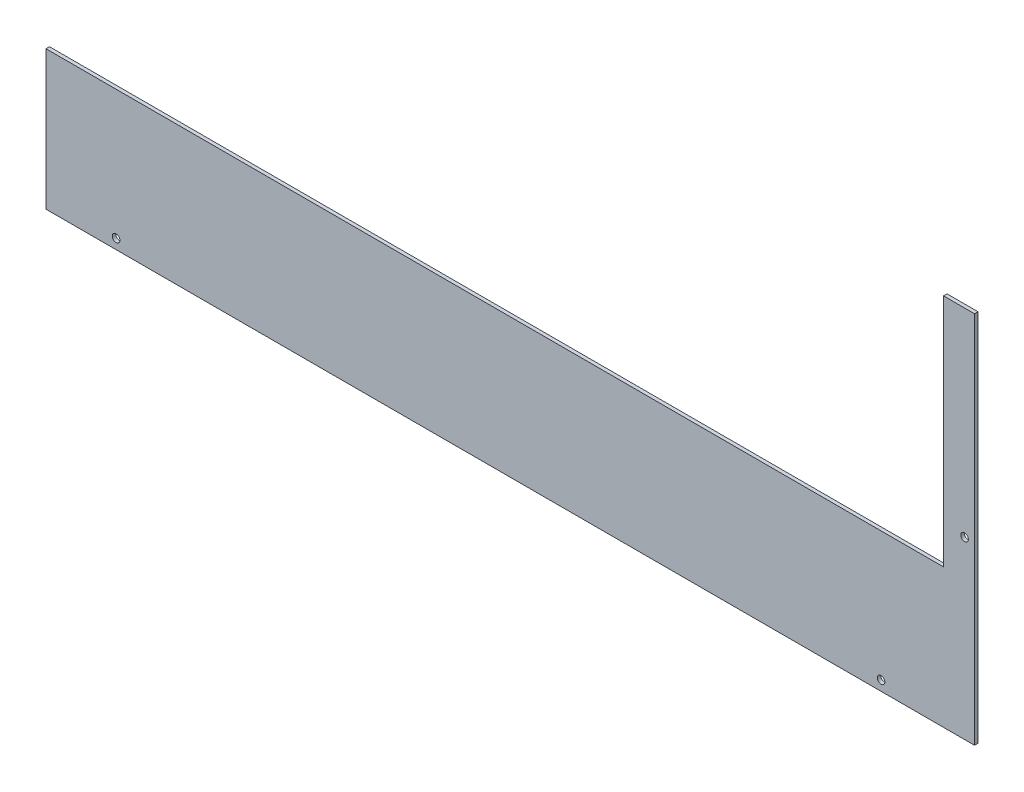
ISO-10303-21;
HEADER;
FILE_DESCRIPTION(('STEP AP214'),'2;1');
FILE_NAME('part.step','',(''),(''),'','','');
FILE_SCHEMA(('AUTOMOTIVE_DESIGN { 1 0 10303 214 1 1 1 1 }'));
ENDSEC;
DATA;
#1=APPLICATION_CONTEXT('core data for automotive mechanical design processes');
#2=APPLICATION_PROTOCOL_DEFINITION('international standard','automotive_design',2000,#1);
#3=PRODUCT_CONTEXT('',#1,'mechanical');
#4=PRODUCT('Part','Part','',(#3));
#5=PRODUCT_RELATED_PRODUCT_CATEGORY('part','',(#4));
#6=PRODUCT_DEFINITION_FORMATION('','',#4);
#7=PRODUCT_DEFINITION_CONTEXT('part definition',#1,'design');
#8=PRODUCT_DEFINITION('design','',#6,#7);
#9=PRODUCT_DEFINITION_SHAPE('','',#8);
#10=(LENGTH_UNIT() NAMED_UNIT(*) SI_UNIT(.MILLI.,.METRE.));
#11=(NAMED_UNIT(*) PLANE_ANGLE_UNIT() SI_UNIT($,.RADIAN.));
#12=(NAMED_UNIT(*) SI_UNIT($,.STERADIAN.) SOLID_ANGLE_UNIT());
#13=UNCERTAINTY_MEASURE_WITH_UNIT(LENGTH_MEASURE(1.E-05),#10,'distance_accuracy_value','');
#14=(GEOMETRIC_REPRESENTATION_CONTEXT(3) GLOBAL_UNCERTAINTY_ASSIGNED_CONTEXT((#13)) GLOBAL_UNIT_ASSIGNED_CONTEXT((#10,
#11,#12)) REPRESENTATION_CONTEXT('',''));
#15=CARTESIAN_POINT('',(0.,0.,0.));
#16=DIRECTION('',(0.,0.,1.));
#17=DIRECTION('',(1.,0.,0.));
#18=AXIS2_PLACEMENT_3D('',#15,#16,#17);
#19=CARTESIAN_POINT('',(0.,0.,3.));
#20=DIRECTION('',(0.,0.,-1.));
#21=DIRECTION('',(-1.,0.,0.));
#22=AXIS2_PLACEMENT_3D('',#19,#20,#21);
#23=PLANE('',#22);
#24=DIRECTION('',(0.,-1.,0.));
#25=VECTOR('',#24,1.);
#26=CARTESIAN_POINT('',(0.,0.,3.));
#27=LINE('',#26,#25);
#28=CARTESIAN_POINT('',(0.,119.,3.));
#29=VERTEX_POINT('',#28);
#30=CARTESIAN_POINT('',(0.,0.,3.));
#31=VERTEX_POINT('',#30);
#32=EDGE_CURVE('E152',#29,#31,#27,.T.);
#33=ORIENTED_EDGE('',*,*,#32,.T.);
#34=DIRECTION('',(1.,0.,0.));
#35=VECTOR('',#34,1.);
#36=CARTESIAN_POINT('',(0.,0.,3.));
#37=LINE('',#36,#35);
#38=CARTESIAN_POINT('',(795.,0.,3.));
#39=VERTEX_POINT('',#38);
#40=EDGE_CURVE('E100',#31,#39,#37,.T.);
#41=ORIENTED_EDGE('',*,*,#40,.T.);
#42=DIRECTION('',(0.,1.,0.));
#43=VECTOR('',#42,1.);
#44=CARTESIAN_POINT('',(795.,0.,3.));
#45=LINE('',#44,#43);
#46=CARTESIAN_POINT('',(795.,320.,3.));
#47=VERTEX_POINT('',#46);
#48=EDGE_CURVE('E113',#39,#47,#45,.T.);
#49=ORIENTED_EDGE('',*,*,#48,.T.);
#50=DIRECTION('',(-1.,0.,0.));
#51=VECTOR('',#50,1.);
#52=CARTESIAN_POINT('',(795.,320.,3.));
#53=LINE('',#52,#51);
#54=CARTESIAN_POINT('',(768.5,320.,3.));
#55=VERTEX_POINT('',#54);
#56=EDGE_CURVE('E107',#47,#55,#53,.T.);
#57=ORIENTED_EDGE('',*,*,#56,.T.);
#58=DIRECTION('',(0.,-1.,0.));
#59=VECTOR('',#58,1.);
#60=CARTESIAN_POINT('',(768.5,320.,3.));
#61=LINE('',#60,#59);
#62=CARTESIAN_POINT('',(768.5,119.,3.));
#63=VERTEX_POINT('',#62);
#64=EDGE_CURVE('E111',#55,#63,#61,.T.);
#65=ORIENTED_EDGE('',*,*,#64,.T.);
#66=DIRECTION('',(-1.,0.,0.));
#67=VECTOR('',#66,1.);
#68=CARTESIAN_POINT('',(0.,119.,3.));
#69=LINE('',#68,#67);
#70=EDGE_CURVE('E63',#63,#29,#69,.T.);
#71=ORIENTED_EDGE('',*,*,#70,.T.);
#72=EDGE_LOOP('',(#33,#41,#49,#57,#65,#71));
#73=FACE_BOUND('',#72,.T.);
#74=CARTESIAN_POINT('',(60.,8.5,3.));
#75=DIRECTION('',(0.,0.,1.));
#76=DIRECTION('',(1.,0.,0.));
#77=AXIS2_PLACEMENT_3D('',#74,#75,#76);
#78=CIRCLE('',#77,3.25000000000001);
#79=CARTESIAN_POINT('',(63.25,8.5,3.));
#80=VERTEX_POINT('',#79);
#81=EDGE_CURVE('E140',#80,#80,#78,.T.);
#82=ORIENTED_EDGE('',*,*,#81,.F.);
#83=EDGE_LOOP('',(#82));
#84=FACE_BOUND('',#83,.T.);
#85=CARTESIAN_POINT('',(715.,8.5,3.));
#86=DIRECTION('',(0.,0.,1.));
#87=DIRECTION('',(1.,0.,0.));
#88=AXIS2_PLACEMENT_3D('',#85,#86,#87);
#89=CIRCLE('',#88,3.24999999999995);
#90=CARTESIAN_POINT('',(718.25,8.5,3.));
#91=VERTEX_POINT('',#90);
#92=EDGE_CURVE('E212',#91,#91,#89,.T.);
#93=ORIENTED_EDGE('',*,*,#92,.F.);
#94=EDGE_LOOP('',(#93));
#95=FACE_BOUND('',#94,.T.);
#96=CARTESIAN_POINT('',(786.5,150.,3.));
#97=DIRECTION('',(0.,0.,1.));
#98=DIRECTION('',(1.,0.,0.));
#99=AXIS2_PLACEMENT_3D('',#96,#97,#98);
#100=CIRCLE('',#99,3.24999999999995);
#101=CARTESIAN_POINT('',(789.75,150.,3.));
#102=VERTEX_POINT('',#101);
#103=EDGE_CURVE('E201',#102,#102,#100,.T.);
#104=ORIENTED_EDGE('',*,*,#103,.F.);
#105=EDGE_LOOP('',(#104));
#106=FACE_BOUND('',#105,.T.);
#107=ADVANCED_FACE('F45',(#73,#84,#95,#106),#23,.F.);
#108=CARTESIAN_POINT('',(0.,0.,0.));
#109=DIRECTION('',(0.,0.,-1.));
#110=DIRECTION('',(-1.,0.,0.));
#111=AXIS2_PLACEMENT_3D('',#108,#109,#110);
#112=PLANE('',#111);
#113=CARTESIAN_POINT('',(715.,8.5,0.));
#114=DIRECTION('',(0.,0.,1.));
#115=DIRECTION('',(1.,0.,0.));
#116=AXIS2_PLACEMENT_3D('',#113,#114,#115);
#117=CIRCLE('',#116,3.24999999999995);
#118=CARTESIAN_POINT('',(718.25,8.5,0.));
#119=VERTEX_POINT('',#118);
#120=EDGE_CURVE('E209',#119,#119,#117,.T.);
#121=ORIENTED_EDGE('',*,*,#120,.T.);
#122=EDGE_LOOP('',(#121));
#123=FACE_BOUND('',#122,.T.);
#124=DIRECTION('',(0.,-1.,0.));
#125=VECTOR('',#124,1.);
#126=CARTESIAN_POINT('',(0.,0.,0.));
#127=LINE('',#126,#125);
#128=CARTESIAN_POINT('',(0.,119.,0.));
#129=VERTEX_POINT('',#128);
#130=CARTESIAN_POINT('',(0.,0.,0.));
#131=VERTEX_POINT('',#130);
#132=EDGE_CURVE('E135',#129,#131,#127,.T.);
#133=ORIENTED_EDGE('',*,*,#132,.F.);
#134=DIRECTION('',(-1.,0.,0.));
#135=VECTOR('',#134,1.);
#136=CARTESIAN_POINT('',(0.,119.,0.));
#137=LINE('',#136,#135);
#138=CARTESIAN_POINT('',(768.5,119.,0.));
#139=VERTEX_POINT('',#138);
#140=EDGE_CURVE('E92',#139,#129,#137,.T.);
#141=ORIENTED_EDGE('',*,*,#140,.F.);
#142=DIRECTION('',(0.,-1.,0.));
#143=VECTOR('',#142,1.);
#144=CARTESIAN_POINT('',(768.5,320.,0.));
#145=LINE('',#144,#143);
#146=CARTESIAN_POINT('',(768.5,320.,0.));
#147=VERTEX_POINT('',#146);
#148=EDGE_CURVE('E86',#147,#139,#145,.T.);
#149=ORIENTED_EDGE('',*,*,#148,.F.);
#150=DIRECTION('',(-1.,0.,0.));
#151=VECTOR('',#150,1.);
#152=CARTESIAN_POINT('',(795.,320.,0.));
#153=LINE('',#152,#151);
#154=CARTESIAN_POINT('',(795.,320.,0.));
#155=VERTEX_POINT('',#154);
#156=EDGE_CURVE('E122',#155,#147,#153,.T.);
#157=ORIENTED_EDGE('',*,*,#156,.F.);
#158=DIRECTION('',(0.,1.,0.));
#159=VECTOR('',#158,1.);
#160=CARTESIAN_POINT('',(795.,0.,0.));
#161=LINE('',#160,#159);
#162=CARTESIAN_POINT('',(795.,0.,0.));
#163=VERTEX_POINT('',#162);
#164=EDGE_CURVE('E143',#163,#155,#161,.T.);
#165=ORIENTED_EDGE('',*,*,#164,.F.);
#166=DIRECTION('',(1.,0.,0.));
#167=VECTOR('',#166,1.);
#168=CARTESIAN_POINT('',(0.,0.,0.));
#169=LINE('',#168,#167);
#170=EDGE_CURVE('E139',#131,#163,#169,.T.);
#171=ORIENTED_EDGE('',*,*,#170,.F.);
#172=EDGE_LOOP('',(#133,#141,#149,#157,#165,#171));
#173=FACE_BOUND('',#172,.T.);
#174=CARTESIAN_POINT('',(60.,8.5,0.));
#175=DIRECTION('',(0.,0.,1.));
#176=DIRECTION('',(1.,0.,0.));
#177=AXIS2_PLACEMENT_3D('',#174,#175,#176);
#178=CIRCLE('',#177,3.25000000000001);
#179=CARTESIAN_POINT('',(63.25,8.5,0.));
#180=VERTEX_POINT('',#179);
#181=EDGE_CURVE('E216',#180,#180,#178,.T.);
#182=ORIENTED_EDGE('',*,*,#181,.T.);
#183=EDGE_LOOP('',(#182));
#184=FACE_BOUND('',#183,.T.);
#185=CARTESIAN_POINT('',(786.5,150.,0.));
#186=DIRECTION('',(0.,0.,1.));
#187=DIRECTION('',(1.,0.,0.));
#188=AXIS2_PLACEMENT_3D('',#185,#186,#187);
#189=CIRCLE('',#188,3.24999999999995);
#190=CARTESIAN_POINT('',(789.75,150.,0.));
#191=VERTEX_POINT('',#190);
#192=EDGE_CURVE('E204',#191,#191,#189,.T.);
#193=ORIENTED_EDGE('',*,*,#192,.T.);
#194=EDGE_LOOP('',(#193));
#195=FACE_BOUND('',#194,.T.);
#196=ADVANCED_FACE('F165',(#123,#173,#184,#195),#112,.T.);
#197=CARTESIAN_POINT('',(0.,0.,3.));
#198=DIRECTION('',(1.,0.,0.));
#199=DIRECTION('',(0.,0.,-1.));
#200=AXIS2_PLACEMENT_3D('',#197,#198,#199);
#201=PLANE('',#200);
#202=ORIENTED_EDGE('',*,*,#132,.T.);
#203=DIRECTION('',(0.,0.,-1.));
#204=VECTOR('',#203,1.);
#205=CARTESIAN_POINT('',(0.,0.,3.));
#206=LINE('',#205,#204);
#207=EDGE_CURVE('E11',#31,#131,#206,.T.);
#208=ORIENTED_EDGE('',*,*,#207,.F.);
#209=ORIENTED_EDGE('',*,*,#32,.F.);
#210=DIRECTION('',(0.,0.,-1.));
#211=VECTOR('',#210,1.);
#212=CARTESIAN_POINT('',(0.,119.,3.));
#213=LINE('',#212,#211);
#214=EDGE_CURVE('E131',#29,#129,#213,.T.);
#215=ORIENTED_EDGE('',*,*,#214,.T.);
#216=EDGE_LOOP('',(#202,#208,#209,#215));
#217=FACE_BOUND('',#216,.T.);
#218=ADVANCED_FACE('F47',(#217),#201,.F.);
#219=CARTESIAN_POINT('',(0.,0.,3.));
#220=DIRECTION('',(0.,1.,0.));
#221=DIRECTION('',(0.,0.,1.));
#222=AXIS2_PLACEMENT_3D('',#219,#220,#221);
#223=PLANE('',#222);
#224=ORIENTED_EDGE('',*,*,#170,.T.);
#225=DIRECTION('',(0.,0.,-1.));
#226=VECTOR('',#225,1.);
#227=CARTESIAN_POINT('',(795.,0.,3.));
#228=LINE('',#227,#226);
#229=EDGE_CURVE('E55',#39,#163,#228,.T.);
#230=ORIENTED_EDGE('',*,*,#229,.F.);
#231=ORIENTED_EDGE('',*,*,#40,.F.);
#232=ORIENTED_EDGE('',*,*,#207,.T.);
#233=EDGE_LOOP('',(#224,#230,#231,#232));
#234=FACE_BOUND('',#233,.T.);
#235=ADVANCED_FACE('F276',(#234),#223,.F.);
#236=CARTESIAN_POINT('',(795.,0.,3.));
#237=DIRECTION('',(-1.,0.,0.));
#238=DIRECTION('',(0.,0.,1.));
#239=AXIS2_PLACEMENT_3D('',#236,#237,#238);
#240=PLANE('',#239);
#241=ORIENTED_EDGE('',*,*,#164,.T.);
#242=DIRECTION('',(0.,0.,-1.));
#243=VECTOR('',#242,1.);
#244=CARTESIAN_POINT('',(795.,320.,3.));
#245=LINE('',#244,#243);
#246=EDGE_CURVE('E124',#47,#155,#245,.T.);
#247=ORIENTED_EDGE('',*,*,#246,.F.);
#248=ORIENTED_EDGE('',*,*,#48,.F.);
#249=ORIENTED_EDGE('',*,*,#229,.T.);
#250=EDGE_LOOP('',(#241,#247,#248,#249));
#251=FACE_BOUND('',#250,.T.);
#252=ADVANCED_FACE('F162',(#251),#240,.F.);
#253=CARTESIAN_POINT('',(795.,320.,3.));
#254=DIRECTION('',(0.,-1.,0.));
#255=DIRECTION('',(0.,0.,-1.));
#256=AXIS2_PLACEMENT_3D('',#253,#254,#255);
#257=PLANE('',#256);
#258=ORIENTED_EDGE('',*,*,#156,.T.);
#259=DIRECTION('',(0.,0.,-1.));
#260=VECTOR('',#259,1.);
#261=CARTESIAN_POINT('',(768.5,320.,3.));
#262=LINE('',#261,#260);
#263=EDGE_CURVE('E119',#55,#147,#262,.T.);
#264=ORIENTED_EDGE('',*,*,#263,.F.);
#265=ORIENTED_EDGE('',*,*,#56,.F.);
#266=ORIENTED_EDGE('',*,*,#246,.T.);
#267=EDGE_LOOP('',(#258,#264,#265,#266));
#268=FACE_BOUND('',#267,.T.);
#269=ADVANCED_FACE('F120',(#268),#257,.F.);
#270=CARTESIAN_POINT('',(768.5,320.,3.));
#271=DIRECTION('',(1.,0.,0.));
#272=DIRECTION('',(0.,0.,-1.));
#273=AXIS2_PLACEMENT_3D('',#270,#271,#272);
#274=PLANE('',#273);
#275=ORIENTED_EDGE('',*,*,#148,.T.);
#276=DIRECTION('',(0.,0.,-1.));
#277=VECTOR('',#276,1.);
#278=CARTESIAN_POINT('',(768.5,119.,3.));
#279=LINE('',#278,#277);
#280=EDGE_CURVE('E125',#63,#139,#279,.T.);
#281=ORIENTED_EDGE('',*,*,#280,.F.);
#282=ORIENTED_EDGE('',*,*,#64,.F.);
#283=ORIENTED_EDGE('',*,*,#263,.T.);
#284=EDGE_LOOP('',(#275,#281,#282,#283));
#285=FACE_BOUND('',#284,.T.);
#286=ADVANCED_FACE('F127',(#285),#274,.F.);
#287=CARTESIAN_POINT('',(0.,119.,3.));
#288=DIRECTION('',(0.,-1.,0.));
#289=DIRECTION('',(0.,0.,-1.));
#290=AXIS2_PLACEMENT_3D('',#287,#288,#289);
#291=PLANE('',#290);
#292=ORIENTED_EDGE('',*,*,#140,.T.);
#293=ORIENTED_EDGE('',*,*,#214,.F.);
#294=ORIENTED_EDGE('',*,*,#70,.F.);
#295=ORIENTED_EDGE('',*,*,#280,.T.);
#296=EDGE_LOOP('',(#292,#293,#294,#295));
#297=FACE_BOUND('',#296,.T.);
#298=ADVANCED_FACE('F170',(#297),#291,.F.);
#299=CARTESIAN_POINT('',(60.,8.5,3.));
#300=DIRECTION('',(0.,0.,-1.));
#301=DIRECTION('',(-1.,0.,0.));
#302=AXIS2_PLACEMENT_3D('',#299,#300,#301);
#303=CYLINDRICAL_SURFACE('',#302,3.25000000000001);
#304=ORIENTED_EDGE('',*,*,#81,.T.);
#305=EDGE_LOOP('',(#304));
#306=FACE_BOUND('',#305,.T.);
#307=ORIENTED_EDGE('',*,*,#181,.F.);
#308=EDGE_LOOP('',(#307));
#309=FACE_BOUND('',#308,.T.);
#310=ADVANCED_FACE('F172',(#306,#309),#303,.F.);
#311=CARTESIAN_POINT('',(715.,8.5,3.));
#312=DIRECTION('',(0.,0.,-1.));
#313=DIRECTION('',(-1.,0.,0.));
#314=AXIS2_PLACEMENT_3D('',#311,#312,#313);
#315=CYLINDRICAL_SURFACE('',#314,3.24999999999995);
#316=ORIENTED_EDGE('',*,*,#92,.T.);
#317=EDGE_LOOP('',(#316));
#318=FACE_BOUND('',#317,.T.);
#319=ORIENTED_EDGE('',*,*,#120,.F.);
#320=EDGE_LOOP('',(#319));
#321=FACE_BOUND('',#320,.T.);
#322=ADVANCED_FACE('F178',(#318,#321),#315,.F.);
#323=CARTESIAN_POINT('',(786.5,150.,3.));
#324=DIRECTION('',(0.,0.,-1.));
#325=DIRECTION('',(-1.,0.,0.));
#326=AXIS2_PLACEMENT_3D('',#323,#324,#325);
#327=CYLINDRICAL_SURFACE('',#326,3.24999999999995);
#328=ORIENTED_EDGE('',*,*,#103,.T.);
#329=EDGE_LOOP('',(#328));
#330=FACE_BOUND('',#329,.T.);
#331=ORIENTED_EDGE('',*,*,#192,.F.);
#332=EDGE_LOOP('',(#331));
#333=FACE_BOUND('',#332,.T.);
#334=ADVANCED_FACE('F192',(#330,#333),#327,.F.);
#335=CLOSED_SHELL('',(#107,#196,#218,#235,#252,#269,#286,#298,#310,#322,#334));
#336=MANIFOLD_SOLID_BREP('B2',#335);
#337=ADVANCED_BREP_SHAPE_REPRESENTATION('',(#18,#336),#14);
#338=SHAPE_DEFINITION_REPRESENTATION(#9,#337);
ENDSEC;
END-ISO-10303-21;
